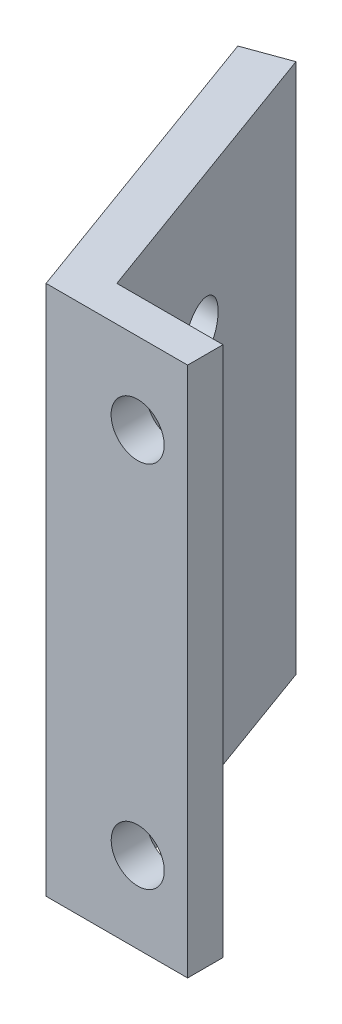
ISO-10303-21;
HEADER;
FILE_DESCRIPTION(('STEP AP214'),'2;1');
FILE_NAME('part.step','',(''),(''),'','','');
FILE_SCHEMA(('AUTOMOTIVE_DESIGN { 1 0 10303 214 1 1 1 1 }'));
ENDSEC;
DATA;
#1=APPLICATION_CONTEXT('core data for automotive mechanical design processes');
#2=APPLICATION_PROTOCOL_DEFINITION('international standard','automotive_design',2000,#1);
#3=PRODUCT_CONTEXT('',#1,'mechanical');
#4=PRODUCT('Part','Part','',(#3));
#5=PRODUCT_RELATED_PRODUCT_CATEGORY('part','',(#4));
#6=PRODUCT_DEFINITION_FORMATION('','',#4);
#7=PRODUCT_DEFINITION_CONTEXT('part definition',#1,'design');
#8=PRODUCT_DEFINITION('design','',#6,#7);
#9=PRODUCT_DEFINITION_SHAPE('','',#8);
#10=(LENGTH_UNIT() NAMED_UNIT(*) SI_UNIT(.MILLI.,.METRE.));
#11=(NAMED_UNIT(*) PLANE_ANGLE_UNIT() SI_UNIT($,.RADIAN.));
#12=(NAMED_UNIT(*) SI_UNIT($,.STERADIAN.) SOLID_ANGLE_UNIT());
#13=UNCERTAINTY_MEASURE_WITH_UNIT(LENGTH_MEASURE(1.E-05),#10,'distance_accuracy_value','');
#14=(GEOMETRIC_REPRESENTATION_CONTEXT(3) GLOBAL_UNCERTAINTY_ASSIGNED_CONTEXT((#13)) GLOBAL_UNIT_ASSIGNED_CONTEXT((#10,
#11,#12)) REPRESENTATION_CONTEXT('',''));
#15=CARTESIAN_POINT('',(0.,0.,0.));
#16=DIRECTION('',(0.,0.,1.));
#17=DIRECTION('',(1.,0.,0.));
#18=AXIS2_PLACEMENT_3D('',#15,#16,#17);
#19=CARTESIAN_POINT('',(3.46389011962785,30.,4.26030128489141));
#20=DIRECTION('',(-1.,0.,0.));
#21=DIRECTION('',(0.,0.,1.));
#22=AXIS2_PLACEMENT_3D('',#19,#20,#21);
#23=PLANE('',#22);
#24=DIRECTION('',(0.,0.,-1.));
#25=VECTOR('',#24,1.);
#26=CARTESIAN_POINT('',(3.46389011962785,0.,4.26030128489141));
#27=LINE('',#26,#25);
#28=CARTESIAN_POINT('',(3.46389011962785,0.,6.26030128489141));
#29=VERTEX_POINT('',#28);
#30=CARTESIAN_POINT('',(3.46389011962785,0.,4.26030128489141));
#31=VERTEX_POINT('',#30);
#32=EDGE_CURVE('E118',#29,#31,#27,.T.);
#33=ORIENTED_EDGE('',*,*,#32,.T.);
#34=DIRECTION('',(0.,-1.,0.));
#35=VECTOR('',#34,1.);
#36=CARTESIAN_POINT('',(3.46389011962785,30.,4.26030128489141));
#37=LINE('',#36,#35);
#38=CARTESIAN_POINT('',(3.46389011962785,30.,4.26030128489141));
#39=VERTEX_POINT('',#38);
#40=EDGE_CURVE('E11',#39,#31,#37,.T.);
#41=ORIENTED_EDGE('',*,*,#40,.F.);
#42=DIRECTION('',(0.,0.,-1.));
#43=VECTOR('',#42,1.);
#44=CARTESIAN_POINT('',(3.46389011962785,30.,4.26030128489141));
#45=LINE('',#44,#43);
#46=CARTESIAN_POINT('',(3.46389011962785,30.,6.26030128489141));
#47=VERTEX_POINT('',#46);
#48=EDGE_CURVE('E129',#47,#39,#45,.T.);
#49=ORIENTED_EDGE('',*,*,#48,.F.);
#50=DIRECTION('',(0.,-1.,0.));
#51=VECTOR('',#50,1.);
#52=CARTESIAN_POINT('',(3.46389011962785,30.,6.26030128489141));
#53=LINE('',#52,#51);
#54=EDGE_CURVE('E114',#47,#29,#53,.T.);
#55=ORIENTED_EDGE('',*,*,#54,.T.);
#56=EDGE_LOOP('',(#33,#41,#49,#55));
#57=FACE_BOUND('',#56,.T.);
#58=ADVANCED_FACE('F32',(#57),#23,.F.);
#59=CARTESIAN_POINT('',(-2.53610988037215,30.,4.26030128489141));
#60=DIRECTION('',(0.,0.,1.));
#61=DIRECTION('',(1.,0.,0.));
#62=AXIS2_PLACEMENT_3D('',#59,#60,#61);
#63=PLANE('',#62);
#64=CARTESIAN_POINT('',(0.643890119627849,4.59,4.26030128489141));
#65=DIRECTION('',(0.,0.,-1.));
#66=DIRECTION('',(-1.,0.,0.));
#67=AXIS2_PLACEMENT_3D('',#64,#65,#66);
#68=CIRCLE('',#67,1.5);
#69=CARTESIAN_POINT('',(-0.856109880372151,4.59,4.26030128489141));
#70=VERTEX_POINT('',#69);
#71=EDGE_CURVE('E140',#70,#70,#68,.T.);
#72=ORIENTED_EDGE('',*,*,#71,.F.);
#73=EDGE_LOOP('',(#72));
#74=FACE_BOUND('',#73,.T.);
#75=CARTESIAN_POINT('',(0.63889011962785,25.414,4.26030128489141));
#76=DIRECTION('',(0.,0.,-1.));
#77=DIRECTION('',(-1.,0.,0.));
#78=AXIS2_PLACEMENT_3D('',#75,#76,#77);
#79=CIRCLE('',#78,1.5);
#80=CARTESIAN_POINT('',(-0.86110988037215,25.414,4.26030128489141));
#81=VERTEX_POINT('',#80);
#82=EDGE_CURVE('E137',#81,#81,#79,.T.);
#83=ORIENTED_EDGE('',*,*,#82,.F.);
#84=EDGE_LOOP('',(#83));
#85=FACE_BOUND('',#84,.T.);
#86=DIRECTION('',(-1.,0.,0.));
#87=VECTOR('',#86,1.);
#88=CARTESIAN_POINT('',(-2.53610988037215,0.,4.26030128489141));
#89=LINE('',#88,#87);
#90=CARTESIAN_POINT('',(-2.53610988037215,0.,4.26030128489141));
#91=VERTEX_POINT('',#90);
#92=EDGE_CURVE('E121',#31,#91,#89,.T.);
#93=ORIENTED_EDGE('',*,*,#92,.T.);
#94=DIRECTION('',(0.,-1.,0.));
#95=VECTOR('',#94,1.);
#96=CARTESIAN_POINT('',(-2.53610988037215,30.,4.26030128489141));
#97=LINE('',#96,#95);
#98=CARTESIAN_POINT('',(-2.53610988037215,30.,4.26030128489141));
#99=VERTEX_POINT('',#98);
#100=EDGE_CURVE('E41',#99,#91,#97,.T.);
#101=ORIENTED_EDGE('',*,*,#100,.F.);
#102=DIRECTION('',(-1.,0.,0.));
#103=VECTOR('',#102,1.);
#104=CARTESIAN_POINT('',(-2.53610988037215,30.,4.26030128489141));
#105=LINE('',#104,#103);
#106=EDGE_CURVE('E87',#39,#99,#105,.T.);
#107=ORIENTED_EDGE('',*,*,#106,.F.);
#108=ORIENTED_EDGE('',*,*,#40,.T.);
#109=EDGE_LOOP('',(#93,#101,#107,#108));
#110=FACE_BOUND('',#109,.T.);
#111=ADVANCED_FACE('F162',(#74,#85,#110),#63,.F.);
#112=CARTESIAN_POINT('',(-2.53610988037215,30.,4.26030128489141));
#113=DIRECTION('',(-0.939692620785907,0.,0.342020143325673));
#114=DIRECTION('',(0.342020143325673,0.,0.939692620785907));
#115=AXIS2_PLACEMENT_3D('',#112,#113,#114);
#116=PLANE('',#115);
#117=CARTESIAN_POINT('',(-5.2658866373687,7.5,-3.23969871510859));
#118=DIRECTION('',(-0.939692620785907,0.,0.342020143325673));
#119=DIRECTION('',(0.342020143325673,0.,0.939692620785907));
#120=AXIS2_PLACEMENT_3D('',#117,#118,#119);
#121=ELLIPSE('',#120,1.59626665871387,1.5);
#122=CARTESIAN_POINT('',(-4.71993128596939,7.5,-1.73969871510859));
#123=VERTEX_POINT('',#122);
#124=EDGE_CURVE('E144',#123,#123,#121,.T.);
#125=ORIENTED_EDGE('',*,*,#124,.T.);
#126=EDGE_LOOP('',(#125));
#127=FACE_BOUND('',#126,.T.);
#128=CARTESIAN_POINT('',(-5.2658866373687,22.5,-3.23969871510859));
#129=DIRECTION('',(-0.939692620785907,0.,0.342020143325673));
#130=DIRECTION('',(0.342020143325673,0.,0.939692620785907));
#131=AXIS2_PLACEMENT_3D('',#128,#129,#130);
#132=ELLIPSE('',#131,1.59626665871387,1.5);
#133=CARTESIAN_POINT('',(-4.71993128596939,22.5,-1.73969871510859));
#134=VERTEX_POINT('',#133);
#135=EDGE_CURVE('E143',#134,#134,#132,.T.);
#136=ORIENTED_EDGE('',*,*,#135,.T.);
#137=EDGE_LOOP('',(#136));
#138=FACE_BOUND('',#137,.T.);
#139=DIRECTION('',(-0.342020143325673,0.,-0.939692620785907));
#140=VECTOR('',#139,1.);
#141=CARTESIAN_POINT('',(-2.53610988037215,0.,4.26030128489141));
#142=LINE('',#141,#140);
#143=CARTESIAN_POINT('',(-8.32846968644629,0.,-11.6540764876536));
#144=VERTEX_POINT('',#143);
#145=EDGE_CURVE('E124',#91,#144,#142,.T.);
#146=ORIENTED_EDGE('',*,*,#145,.T.);
#147=DIRECTION('',(0.,-1.,0.));
#148=VECTOR('',#147,1.);
#149=CARTESIAN_POINT('',(-8.32846968644629,30.,-11.6540764876536));
#150=LINE('',#149,#148);
#151=CARTESIAN_POINT('',(-8.32846968644629,30.,-11.6540764876536));
#152=VERTEX_POINT('',#151);
#153=EDGE_CURVE('E109',#152,#144,#150,.T.);
#154=ORIENTED_EDGE('',*,*,#153,.F.);
#155=DIRECTION('',(-0.342020143325673,0.,-0.939692620785907));
#156=VECTOR('',#155,1.);
#157=CARTESIAN_POINT('',(-2.53610988037215,30.,4.26030128489141));
#158=LINE('',#157,#156);
#159=EDGE_CURVE('E100',#99,#152,#158,.T.);
#160=ORIENTED_EDGE('',*,*,#159,.F.);
#161=ORIENTED_EDGE('',*,*,#100,.T.);
#162=EDGE_LOOP('',(#146,#154,#160,#161));
#163=FACE_BOUND('',#162,.T.);
#164=ADVANCED_FACE('F165',(#127,#138,#163),#116,.F.);
#165=CARTESIAN_POINT('',(-10.7373017392518,30.,-10.7773333210861));
#166=DIRECTION('',(0.342020143325673,0.,0.939692620785907));
#167=DIRECTION('',(0.939692620785907,0.,-0.342020143325673));
#168=AXIS2_PLACEMENT_3D('',#165,#166,#167);
#169=PLANE('',#168);
#170=DIRECTION('',(-0.939692620785907,0.,0.342020143325673));
#171=VECTOR('',#170,1.);
#172=CARTESIAN_POINT('',(-10.7373017392518,0.,-10.7773333210861));
#173=LINE('',#172,#171);
#174=CARTESIAN_POINT('',(-10.7373017392518,0.,-10.7773333210861));
#175=VERTEX_POINT('',#174);
#176=EDGE_CURVE('E108',#144,#175,#173,.T.);
#177=ORIENTED_EDGE('',*,*,#176,.T.);
#178=DIRECTION('',(0.,-1.,0.));
#179=VECTOR('',#178,1.);
#180=CARTESIAN_POINT('',(-10.7373017392518,30.,-10.7773333210861));
#181=LINE('',#180,#179);
#182=CARTESIAN_POINT('',(-10.7373017392518,30.,-10.7773333210861));
#183=VERTEX_POINT('',#182);
#184=EDGE_CURVE('E105',#183,#175,#181,.T.);
#185=ORIENTED_EDGE('',*,*,#184,.F.);
#186=DIRECTION('',(-0.939692620785907,0.,0.342020143325673));
#187=VECTOR('',#186,1.);
#188=CARTESIAN_POINT('',(-10.7373017392518,30.,-10.7773333210861));
#189=LINE('',#188,#187);
#190=EDGE_CURVE('E94',#152,#183,#189,.T.);
#191=ORIENTED_EDGE('',*,*,#190,.F.);
#192=ORIENTED_EDGE('',*,*,#153,.T.);
#193=EDGE_LOOP('',(#177,#185,#191,#192));
#194=FACE_BOUND('',#193,.T.);
#195=ADVANCED_FACE('F106',(#194),#169,.F.);
#196=CARTESIAN_POINT('',(-4.53610988037215,30.,6.26030128489141));
#197=DIRECTION('',(0.939692620785907,0.,-0.342020143325673));
#198=DIRECTION('',(-0.342020143325673,0.,-0.939692620785907));
#199=AXIS2_PLACEMENT_3D('',#196,#197,#198);
#200=PLANE('',#199);
#201=CARTESIAN_POINT('',(-7.99382710590112,7.5,-3.23969871510859));
#202=DIRECTION('',(0.939692620785907,0.,-0.342020143325673));
#203=DIRECTION('',(0.342020143325673,0.,0.939692620785907));
#204=AXIS2_PLACEMENT_3D('',#201,#202,#203);
#205=ELLIPSE('',#204,1.59626665871387,1.5);
#206=CARTESIAN_POINT('',(-7.44787175450181,7.5,-1.73969871510859));
#207=VERTEX_POINT('',#206);
#208=EDGE_CURVE('E35',#207,#207,#205,.T.);
#209=ORIENTED_EDGE('',*,*,#208,.T.);
#210=EDGE_LOOP('',(#209));
#211=FACE_BOUND('',#210,.T.);
#212=CARTESIAN_POINT('',(-7.99382710590112,22.5,-3.23969871510859));
#213=DIRECTION('',(0.939692620785907,0.,-0.342020143325673));
#214=DIRECTION('',(0.342020143325673,0.,0.939692620785907));
#215=AXIS2_PLACEMENT_3D('',#212,#213,#214);
#216=ELLIPSE('',#215,1.59626665871387,1.5);
#217=CARTESIAN_POINT('',(-7.44787175450181,22.5,-1.73969871510859));
#218=VERTEX_POINT('',#217);
#219=EDGE_CURVE('E141',#218,#218,#216,.T.);
#220=ORIENTED_EDGE('',*,*,#219,.T.);
#221=EDGE_LOOP('',(#220));
#222=FACE_BOUND('',#221,.T.);
#223=DIRECTION('',(0.342020143325673,0.,0.939692620785907));
#224=VECTOR('',#223,1.);
#225=CARTESIAN_POINT('',(-4.53610988037215,0.,6.26030128489141));
#226=LINE('',#225,#224);
#227=CARTESIAN_POINT('',(-4.53610988037215,0.,6.26030128489141));
#228=VERTEX_POINT('',#227);
#229=EDGE_CURVE('E73',#175,#228,#226,.T.);
#230=ORIENTED_EDGE('',*,*,#229,.T.);
#231=DIRECTION('',(0.,-1.,0.));
#232=VECTOR('',#231,1.);
#233=CARTESIAN_POINT('',(-4.53610988037215,30.,6.26030128489141));
#234=LINE('',#233,#232);
#235=CARTESIAN_POINT('',(-4.53610988037215,30.,6.26030128489141));
#236=VERTEX_POINT('',#235);
#237=EDGE_CURVE('E110',#236,#228,#234,.T.);
#238=ORIENTED_EDGE('',*,*,#237,.F.);
#239=DIRECTION('',(0.342020143325673,0.,0.939692620785907));
#240=VECTOR('',#239,1.);
#241=CARTESIAN_POINT('',(-4.53610988037215,30.,6.26030128489141));
#242=LINE('',#241,#240);
#243=EDGE_CURVE('E98',#183,#236,#242,.T.);
#244=ORIENTED_EDGE('',*,*,#243,.F.);
#245=ORIENTED_EDGE('',*,*,#184,.T.);
#246=EDGE_LOOP('',(#230,#238,#244,#245));
#247=FACE_BOUND('',#246,.T.);
#248=ADVANCED_FACE('F112',(#211,#222,#247),#200,.F.);
#249=CARTESIAN_POINT('',(-4.53610988037215,30.,6.26030128489141));
#250=DIRECTION('',(0.,0.,-1.));
#251=DIRECTION('',(-1.,0.,0.));
#252=AXIS2_PLACEMENT_3D('',#249,#250,#251);
#253=PLANE('',#252);
#254=CARTESIAN_POINT('',(0.643890119627849,4.59,6.26030128489141));
#255=DIRECTION('',(0.,0.,-1.));
#256=DIRECTION('',(-1.,0.,0.));
#257=AXIS2_PLACEMENT_3D('',#254,#255,#256);
#258=CIRCLE('',#257,1.5);
#259=CARTESIAN_POINT('',(-0.856109880372151,4.59,6.26030128489141));
#260=VERTEX_POINT('',#259);
#261=EDGE_CURVE('E138',#260,#260,#258,.T.);
#262=ORIENTED_EDGE('',*,*,#261,.T.);
#263=EDGE_LOOP('',(#262));
#264=FACE_BOUND('',#263,.T.);
#265=CARTESIAN_POINT('',(0.63889011962785,25.414,6.26030128489141));
#266=DIRECTION('',(0.,0.,-1.));
#267=DIRECTION('',(-1.,0.,0.));
#268=AXIS2_PLACEMENT_3D('',#265,#266,#267);
#269=CIRCLE('',#268,1.5);
#270=CARTESIAN_POINT('',(-0.86110988037215,25.414,6.26030128489141));
#271=VERTEX_POINT('',#270);
#272=EDGE_CURVE('E122',#271,#271,#269,.T.);
#273=ORIENTED_EDGE('',*,*,#272,.T.);
#274=EDGE_LOOP('',(#273));
#275=FACE_BOUND('',#274,.T.);
#276=DIRECTION('',(1.,0.,0.));
#277=VECTOR('',#276,1.);
#278=CARTESIAN_POINT('',(-4.53610988037215,0.,6.26030128489141));
#279=LINE('',#278,#277);
#280=EDGE_CURVE('E79',#228,#29,#279,.T.);
#281=ORIENTED_EDGE('',*,*,#280,.T.);
#282=ORIENTED_EDGE('',*,*,#54,.F.);
#283=DIRECTION('',(1.,0.,0.));
#284=VECTOR('',#283,1.);
#285=CARTESIAN_POINT('',(-4.53610988037215,30.,6.26030128489141));
#286=LINE('',#285,#284);
#287=EDGE_CURVE('E50',#236,#47,#286,.T.);
#288=ORIENTED_EDGE('',*,*,#287,.F.);
#289=ORIENTED_EDGE('',*,*,#237,.T.);
#290=EDGE_LOOP('',(#281,#282,#288,#289));
#291=FACE_BOUND('',#290,.T.);
#292=ADVANCED_FACE('F170',(#264,#275,#291),#253,.F.);
#293=CARTESIAN_POINT('',(0.,30.,0.));
#294=DIRECTION('',(0.,1.,0.));
#295=DIRECTION('',(0.,0.,1.));
#296=AXIS2_PLACEMENT_3D('',#293,#294,#295);
#297=PLANE('',#296);
#298=ORIENTED_EDGE('',*,*,#48,.T.);
#299=ORIENTED_EDGE('',*,*,#106,.T.);
#300=ORIENTED_EDGE('',*,*,#159,.T.);
#301=ORIENTED_EDGE('',*,*,#190,.T.);
#302=ORIENTED_EDGE('',*,*,#243,.T.);
#303=ORIENTED_EDGE('',*,*,#287,.T.);
#304=EDGE_LOOP('',(#298,#299,#300,#301,#302,#303));
#305=FACE_BOUND('',#304,.T.);
#306=ADVANCED_FACE('F96',(#305),#297,.T.);
#307=CARTESIAN_POINT('',(0.,0.,0.));
#308=DIRECTION('',(0.,1.,0.));
#309=DIRECTION('',(0.,0.,1.));
#310=AXIS2_PLACEMENT_3D('',#307,#308,#309);
#311=PLANE('',#310);
#312=ORIENTED_EDGE('',*,*,#32,.F.);
#313=ORIENTED_EDGE('',*,*,#280,.F.);
#314=ORIENTED_EDGE('',*,*,#229,.F.);
#315=ORIENTED_EDGE('',*,*,#176,.F.);
#316=ORIENTED_EDGE('',*,*,#145,.F.);
#317=ORIENTED_EDGE('',*,*,#92,.F.);
#318=EDGE_LOOP('',(#312,#313,#314,#315,#316,#317));
#319=FACE_BOUND('',#318,.T.);
#320=ADVANCED_FACE('F168',(#319),#311,.F.);
#321=CARTESIAN_POINT('',(0.63889011962785,25.414,34.2603012848914));
#322=DIRECTION('',(0.,0.,-1.));
#323=DIRECTION('',(-1.,0.,0.));
#324=AXIS2_PLACEMENT_3D('',#321,#322,#323);
#325=CYLINDRICAL_SURFACE('',#324,1.5);
#326=ORIENTED_EDGE('',*,*,#82,.T.);
#327=EDGE_LOOP('',(#326));
#328=FACE_BOUND('',#327,.T.);
#329=ORIENTED_EDGE('',*,*,#272,.F.);
#330=EDGE_LOOP('',(#329));
#331=FACE_BOUND('',#330,.T.);
#332=ADVANCED_FACE('F240',(#328,#331),#325,.F.);
#333=CARTESIAN_POINT('',(0.643890119627849,4.59,34.2603012848914));
#334=DIRECTION('',(0.,0.,-1.));
#335=DIRECTION('',(-1.,0.,0.));
#336=AXIS2_PLACEMENT_3D('',#333,#334,#335);
#337=CYLINDRICAL_SURFACE('',#336,1.5);
#338=ORIENTED_EDGE('',*,*,#71,.T.);
#339=EDGE_LOOP('',(#338));
#340=FACE_BOUND('',#339,.T.);
#341=ORIENTED_EDGE('',*,*,#261,.F.);
#342=EDGE_LOOP('',(#341));
#343=FACE_BOUND('',#342,.T.);
#344=ADVANCED_FACE('F220',(#340,#343),#337,.F.);
#345=CARTESIAN_POINT('',(-32.5361098803722,22.5,-3.23969871510859));
#346=DIRECTION('',(1.,0.,0.));
#347=DIRECTION('',(0.,0.,-1.));
#348=AXIS2_PLACEMENT_3D('',#345,#346,#347);
#349=CYLINDRICAL_SURFACE('',#348,1.5);
#350=ORIENTED_EDGE('',*,*,#219,.F.);
#351=EDGE_LOOP('',(#350));
#352=FACE_BOUND('',#351,.T.);
#353=ORIENTED_EDGE('',*,*,#135,.F.);
#354=EDGE_LOOP('',(#353));
#355=FACE_BOUND('',#354,.T.);
#356=ADVANCED_FACE('F214',(#352,#355),#349,.F.);
#357=CARTESIAN_POINT('',(-32.5361098803722,7.5,-3.23969871510859));
#358=DIRECTION('',(1.,0.,0.));
#359=DIRECTION('',(0.,0.,-1.));
#360=AXIS2_PLACEMENT_3D('',#357,#358,#359);
#361=CYLINDRICAL_SURFACE('',#360,1.5);
#362=ORIENTED_EDGE('',*,*,#208,.F.);
#363=EDGE_LOOP('',(#362));
#364=FACE_BOUND('',#363,.T.);
#365=ORIENTED_EDGE('',*,*,#124,.F.);
#366=EDGE_LOOP('',(#365));
#367=FACE_BOUND('',#366,.T.);
#368=ADVANCED_FACE('F219',(#364,#367),#361,.F.);
#369=CLOSED_SHELL('',(#58,#111,#164,#195,#248,#292,#306,#320,#332,#344,#356,#368));
#370=MANIFOLD_SOLID_BREP('B2',#369);
#371=ADVANCED_BREP_SHAPE_REPRESENTATION('',(#18,#370),#14);
#372=SHAPE_DEFINITION_REPRESENTATION(#9,#371);
ENDSEC;
END-ISO-10303-21;
